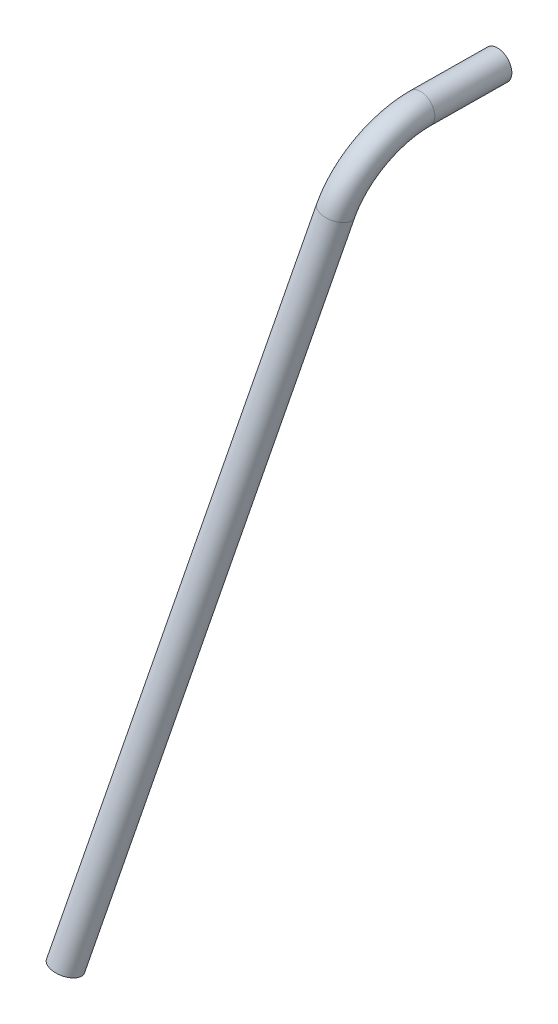
ISO-10303-21;
HEADER;
FILE_DESCRIPTION(('STEP AP214'),'2;1');
FILE_NAME('part.step','',(''),(''),'','','');
FILE_SCHEMA(('AUTOMOTIVE_DESIGN { 1 0 10303 214 1 1 1 1 }'));
ENDSEC;
DATA;
#1=APPLICATION_CONTEXT('core data for automotive mechanical design processes');
#2=APPLICATION_PROTOCOL_DEFINITION('international standard','automotive_design',2000,#1);
#3=PRODUCT_CONTEXT('',#1,'mechanical');
#4=PRODUCT('Part','Part','',(#3));
#5=PRODUCT_RELATED_PRODUCT_CATEGORY('part','',(#4));
#6=PRODUCT_DEFINITION_FORMATION('','',#4);
#7=PRODUCT_DEFINITION_CONTEXT('part definition',#1,'design');
#8=PRODUCT_DEFINITION('design','',#6,#7);
#9=PRODUCT_DEFINITION_SHAPE('','',#8);
#10=(LENGTH_UNIT() NAMED_UNIT(*) SI_UNIT(.MILLI.,.METRE.));
#11=(NAMED_UNIT(*) PLANE_ANGLE_UNIT() SI_UNIT($,.RADIAN.));
#12=(NAMED_UNIT(*) SI_UNIT($,.STERADIAN.) SOLID_ANGLE_UNIT());
#13=UNCERTAINTY_MEASURE_WITH_UNIT(LENGTH_MEASURE(1.E-05),#10,'distance_accuracy_value','');
#14=(GEOMETRIC_REPRESENTATION_CONTEXT(3) GLOBAL_UNCERTAINTY_ASSIGNED_CONTEXT((#13)) GLOBAL_UNIT_ASSIGNED_CONTEXT((#10,
#11,#12)) REPRESENTATION_CONTEXT('',''));
#15=CARTESIAN_POINT('',(0.,0.,0.));
#16=DIRECTION('',(0.,0.,1.));
#17=DIRECTION('',(1.,0.,0.));
#18=AXIS2_PLACEMENT_3D('',#15,#16,#17);
#19=CARTESIAN_POINT('',(167.41447236934,-265.926674790163,-205.540959925347));
#20=DIRECTION('',(-0.171785151241259,-0.956315071609331,0.236540367856861));
#21=DIRECTION('',(0.975197019403564,-0.131058986643189,0.178365678779485));
#22=AXIS2_PLACEMENT_3D('',#19,#20,#21);
#23=PLANE('',#22);
#24=CARTESIAN_POINT('',(167.41447236934,-265.926674790163,-205.540959925347));
#25=DIRECTION('',(-0.171785151241259,-0.956315071609331,0.236540367856861));
#26=DIRECTION('',(0.,-0.240109733885566,-0.970745752343734));
#27=AXIS2_PLACEMENT_3D('',#24,#25,#26);
#28=CIRCLE('',#27,3.17499999999999);
#29=CARTESIAN_POINT('',(167.41447236934,-266.689023195249,-208.623077689039));
#30=VERTEX_POINT('',#29);
#31=EDGE_CURVE('E79',#30,#30,#28,.T.);
#32=ORIENTED_EDGE('',*,*,#31,.F.);
#33=EDGE_LOOP('',(#32));
#34=FACE_BOUND('',#33,.T.);
#35=CARTESIAN_POINT('',(167.41447236934,-265.926674790163,-205.540959925347));
#36=DIRECTION('',(-0.171785151241259,-0.956315071609331,0.236540367856861));
#37=DIRECTION('',(0.975197019403564,-0.131058986643189,0.178365678779485));
#38=AXIS2_PLACEMENT_3D('',#35,#36,#37);
#39=CIRCLE('',#38,7.14374999999999);
#40=CARTESIAN_POINT('',(174.381036076704,-266.862927425995,-204.266760107566));
#41=VERTEX_POINT('',#40);
#42=EDGE_CURVE('E74',#41,#41,#39,.T.);
#43=ORIENTED_EDGE('',*,*,#42,.T.);
#44=EDGE_LOOP('',(#43));
#45=FACE_BOUND('',#44,.T.);
#46=ADVANCED_FACE('F60',(#34,#45),#23,.T.);
#47=CARTESIAN_POINT('',(229.867507634517,78.3691186212652,-358.766948389016));
#48=DIRECTION('',(-0.00861538953736703,0.00164985672359026,0.999961525777823));
#49=DIRECTION('',(0.999962886741841,0.,0.00861540126305333));
#50=AXIS2_PLACEMENT_3D('',#47,#48,#49);
#51=PLANE('',#50);
#52=CARTESIAN_POINT('',(229.867507634517,78.3691186212652,-358.766948389016));
#53=DIRECTION('',(-0.00861538953736703,0.00164985672359026,0.999961525777823));
#54=DIRECTION('',(0.999962886741841,0.,0.00861540126305333));
#55=AXIS2_PLACEMENT_3D('',#52,#53,#54);
#56=CIRCLE('',#55,3.17499999999999);
#57=CARTESIAN_POINT('',(233.042389799923,78.3691186212652,-358.739594490005));
#58=VERTEX_POINT('',#57);
#59=EDGE_CURVE('E82',#58,#58,#56,.T.);
#60=ORIENTED_EDGE('',*,*,#59,.T.);
#61=EDGE_LOOP('',(#60));
#62=FACE_BOUND('',#61,.T.);
#63=CARTESIAN_POINT('',(229.867507634517,78.3691186212652,-358.766948389016));
#64=DIRECTION('',(-0.00861538953736703,0.00164985672359026,0.999961525777823));
#65=DIRECTION('',(0.999962886741841,0.,0.00861540126305333));
#66=AXIS2_PLACEMENT_3D('',#63,#64,#65);
#67=CIRCLE('',#66,7.14374999999999);
#68=CARTESIAN_POINT('',(237.010992506679,78.3691186212652,-358.705402116243));
#69=VERTEX_POINT('',#68);
#70=EDGE_CURVE('E11',#69,#69,#67,.T.);
#71=ORIENTED_EDGE('',*,*,#70,.F.);
#72=EDGE_LOOP('',(#71));
#73=FACE_BOUND('',#72,.T.);
#74=ADVANCED_FACE('F92',(#62,#73),#51,.F.);
#75=CARTESIAN_POINT('',(167.41447236934,-265.926674790163,-205.540959925347));
#76=DIRECTION('',(0.171785151241255,0.956315071609331,-0.236540367856862));
#77=DIRECTION('',(0.,0.240109733885567,0.970745752343734));
#78=AXIS2_PLACEMENT_3D('',#75,#76,#77);
#79=CYLINDRICAL_SURFACE('',#78,7.14374999999999);
#80=CARTESIAN_POINT('',(224.137929309202,49.8485618552385,-283.646589391683));
#81=DIRECTION('',(-0.171785151241259,-0.956315071609331,0.236540367856861));
#82=DIRECTION('',(0.975197019403564,-0.131058986643189,0.178365678779485));
#83=AXIS2_PLACEMENT_3D('',#80,#81,#82);
#84=CIRCLE('',#83,7.14374999999999);
#85=CARTESIAN_POINT('',(224.373202505573,51.5230608381555,-276.70584996841));
#86=VERTEX_POINT('',#85);
#87=EDGE_CURVE('E70',#86,#86,#84,.T.);
#88=ORIENTED_EDGE('',*,*,#87,.T.);
#89=EDGE_LOOP('',(#88));
#90=FACE_BOUND('',#89,.T.);
#91=ORIENTED_EDGE('',*,*,#42,.F.);
#92=EDGE_LOOP('',(#91));
#93=FACE_BOUND('',#92,.T.);
#94=ADVANCED_FACE('F118',(#90,#93),#79,.T.);
#95=CARTESIAN_POINT('',(222.883138928558,40.917900613014,-320.663866315807));
#96=DIRECTION('',(-0.984583772386266,0.174693624492674,-0.00877112964460215));
#97=DIRECTION('',(-0.174700344707864,-0.984621647923178,0.));
#98=AXIS2_PLACEMENT_3D('',#95,#96,#97);
#99=TOROIDAL_SURFACE('',#98,38.1000000000001,7.14374999999999);
#100=CARTESIAN_POINT('',(229.539261293143,78.4319781624341,-320.668414256881));
#101=DIRECTION('',(-0.00861538953736703,0.00164985672359026,0.999961525777823));
#102=DIRECTION('',(0.999962886741841,0.,0.00861540126305333));
#103=AXIS2_PLACEMENT_3D('',#100,#101,#102);
#104=CIRCLE('',#103,7.14374999999999);
#105=CARTESIAN_POINT('',(230.787284236503,85.4658677029503,-320.669266995832));
#106=VERTEX_POINT('',#105);
#107=EDGE_CURVE('E66',#106,#106,#104,.T.);
#108=CARTESIAN_POINT('',(222.883138928558,40.917900613014,-320.663866315807));
#109=DIRECTION('',(-0.984583772386266,0.174693624492674,-0.00877112964460215));
#110=DIRECTION('',(-0.174700344707864,-0.984621647923178,0.));
#111=AXIS2_PLACEMENT_3D('',#108,#109,#110);
#112=CIRCLE('',#111,45.2437500000001);
#113=EDGE_CURVE('',#86,#106,#112,.T.);
#114=ORIENTED_EDGE('',*,*,#87,.F.);
#115=ORIENTED_EDGE('',*,*,#107,.T.);
#116=ORIENTED_EDGE('',*,*,#113,.T.);
#117=ORIENTED_EDGE('',*,*,#113,.F.);
#118=EDGE_LOOP('',(#114,#116,#115,#117));
#119=FACE_BOUND('',#118,.T.);
#120=ADVANCED_FACE('F120',(#119),#99,.T.);
#121=CARTESIAN_POINT('',(229.539261293143,78.431978162434,-320.668414256881));
#122=DIRECTION('',(0.00861538953736265,-0.00164985672359099,-0.999961525777823));
#123=DIRECTION('',(-0.999962886741841,0.,-0.00861540126304896));
#124=AXIS2_PLACEMENT_3D('',#121,#122,#123);
#125=CYLINDRICAL_SURFACE('',#124,7.14374999999999);
#126=ORIENTED_EDGE('',*,*,#70,.T.);
#127=EDGE_LOOP('',(#126));
#128=FACE_BOUND('',#127,.T.);
#129=ORIENTED_EDGE('',*,*,#107,.F.);
#130=EDGE_LOOP('',(#129));
#131=FACE_BOUND('',#130,.T.);
#132=ADVANCED_FACE('F110',(#128,#131),#125,.T.);
#133=CARTESIAN_POINT('',(166.847237799941,-269.084427156617,-204.759903630684));
#134=DIRECTION('',(0.171785151241255,0.956315071609331,-0.236540367856862));
#135=DIRECTION('',(0.,0.240109733885567,0.970745752343734));
#136=AXIS2_PLACEMENT_3D('',#133,#134,#135);
#137=CYLINDRICAL_SURFACE('',#136,3.17499999999999);
#138=CARTESIAN_POINT('',(224.137929309202,49.8485618552385,-283.646589391683));
#139=DIRECTION('',(-0.171785151241257,-0.956315071609331,0.236540367856862));
#140=DIRECTION('',(0.975197019403564,-0.131058986643187,0.178365678779484));
#141=AXIS2_PLACEMENT_3D('',#138,#139,#140);
#142=CIRCLE('',#141,3.17499999999999);
#143=CARTESIAN_POINT('',(224.242495174256,50.5927836254239,-280.561816314673));
#144=VERTEX_POINT('',#143);
#145=EDGE_CURVE('E83',#144,#144,#142,.T.);
#146=ORIENTED_EDGE('',*,*,#145,.F.);
#147=EDGE_LOOP('',(#146));
#148=FACE_BOUND('',#147,.T.);
#149=ORIENTED_EDGE('',*,*,#31,.T.);
#150=EDGE_LOOP('',(#149));
#151=FACE_BOUND('',#150,.T.);
#152=ADVANCED_FACE('F100',(#148,#151),#137,.F.);
#153=CARTESIAN_POINT('',(222.883138928558,40.917900613014,-320.663866315807));
#154=DIRECTION('',(-0.984583772386266,0.174693624492674,-0.00877112964460215));
#155=DIRECTION('',(-0.174700344707864,-0.984621647923178,0.));
#156=AXIS2_PLACEMENT_3D('',#153,#154,#155);
#157=TOROIDAL_SURFACE('',#156,38.1000000000001,3.17499999999999);
#158=CARTESIAN_POINT('',(229.539261293144,78.4319781624339,-320.66841425688));
#159=DIRECTION('',(-0.00861538953736703,0.00164985672359026,0.999961525777823));
#160=DIRECTION('',(0.999962886741841,0.,0.00861540126305333));
#161=AXIS2_PLACEMENT_3D('',#158,#159,#160);
#162=CIRCLE('',#161,3.17499999999999);
#163=CARTESIAN_POINT('',(230.09393815686,81.5581512915523,-320.66879325197));
#164=VERTEX_POINT('',#163);
#165=EDGE_CURVE('E86',#164,#164,#162,.T.);
#166=CARTESIAN_POINT('',(222.883138928558,40.917900613014,-320.663866315807));
#167=DIRECTION('',(-0.984583772386266,0.174693624492674,-0.00877112964460215));
#168=DIRECTION('',(-0.174700344707864,-0.984621647923178,0.));
#169=AXIS2_PLACEMENT_3D('',#166,#167,#168);
#170=CIRCLE('',#169,41.2750000000001);
#171=EDGE_CURVE('',#144,#164,#170,.T.);
#172=ORIENTED_EDGE('',*,*,#145,.T.);
#173=ORIENTED_EDGE('',*,*,#165,.F.);
#174=ORIENTED_EDGE('',*,*,#171,.T.);
#175=ORIENTED_EDGE('',*,*,#171,.F.);
#176=EDGE_LOOP('',(#172,#174,#173,#175));
#177=FACE_BOUND('',#176,.T.);
#178=ADVANCED_FACE('F98',(#177),#157,.F.);
#179=CARTESIAN_POINT('',(229.539261293144,78.431978162434,-320.66841425688));
#180=DIRECTION('',(0.00861538953736274,-0.00164985672359113,-0.999961525777823));
#181=DIRECTION('',(-0.999962886741841,0.,-0.00861540126304904));
#182=AXIS2_PLACEMENT_3D('',#179,#180,#181);
#183=CYLINDRICAL_SURFACE('',#182,3.17499999999999);
#184=ORIENTED_EDGE('',*,*,#59,.F.);
#185=EDGE_LOOP('',(#184));
#186=FACE_BOUND('',#185,.T.);
#187=ORIENTED_EDGE('',*,*,#165,.T.);
#188=EDGE_LOOP('',(#187));
#189=FACE_BOUND('',#188,.T.);
#190=ADVANCED_FACE('F95',(#186,#189),#183,.F.);
#191=CLOSED_SHELL('',(#46,#74,#94,#120,#132,#152,#178,#190));
#192=MANIFOLD_SOLID_BREP('B2',#191);
#193=ADVANCED_BREP_SHAPE_REPRESENTATION('',(#18,#192),#14);
#194=SHAPE_DEFINITION_REPRESENTATION(#9,#193);
ENDSEC;
END-ISO-10303-21;
